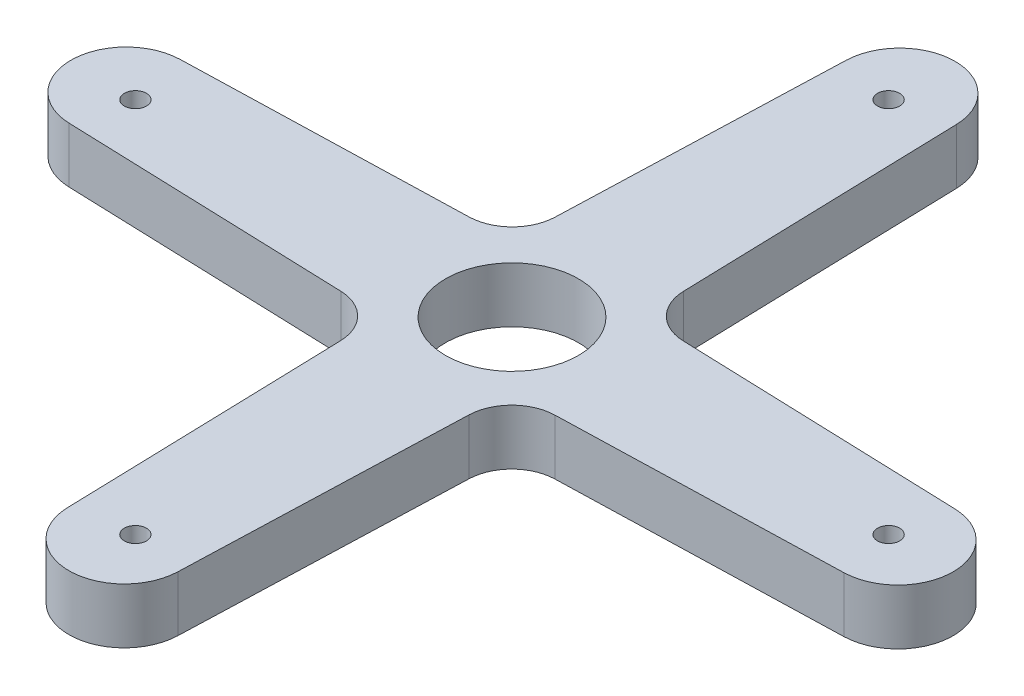
ISO-10303-21;
HEADER;
FILE_DESCRIPTION(('STEP AP214'),'2;1');
FILE_NAME('part.step','',(''),(''),'','','');
FILE_SCHEMA(('AUTOMOTIVE_DESIGN { 1 0 10303 214 1 1 1 1 }'));
ENDSEC;
DATA;
#1=APPLICATION_CONTEXT('core data for automotive mechanical design processes');
#2=APPLICATION_PROTOCOL_DEFINITION('international standard','automotive_design',2000,#1);
#3=PRODUCT_CONTEXT('',#1,'mechanical');
#4=PRODUCT('Part','Part','',(#3));
#5=PRODUCT_RELATED_PRODUCT_CATEGORY('part','',(#4));
#6=PRODUCT_DEFINITION_FORMATION('','',#4);
#7=PRODUCT_DEFINITION_CONTEXT('part definition',#1,'design');
#8=PRODUCT_DEFINITION('design','',#6,#7);
#9=PRODUCT_DEFINITION_SHAPE('','',#8);
#10=(LENGTH_UNIT() NAMED_UNIT(*) SI_UNIT(.MILLI.,.METRE.));
#11=(NAMED_UNIT(*) PLANE_ANGLE_UNIT() SI_UNIT($,.RADIAN.));
#12=(NAMED_UNIT(*) SI_UNIT($,.STERADIAN.) SOLID_ANGLE_UNIT());
#13=UNCERTAINTY_MEASURE_WITH_UNIT(LENGTH_MEASURE(1.E-05),#10,'distance_accuracy_value','');
#14=(GEOMETRIC_REPRESENTATION_CONTEXT(3) GLOBAL_UNCERTAINTY_ASSIGNED_CONTEXT((#13)) GLOBAL_UNIT_ASSIGNED_CONTEXT((#10,
#11,#12)) REPRESENTATION_CONTEXT('',''));
#15=CARTESIAN_POINT('',(0.,0.,0.));
#16=DIRECTION('',(0.,0.,1.));
#17=DIRECTION('',(1.,0.,0.));
#18=AXIS2_PLACEMENT_3D('',#15,#16,#17);
#19=CARTESIAN_POINT('',(2.91547513756856,2.5,2.91547513756856));
#20=DIRECTION('',(-0.999409390507672,0.,-0.0343637914829516));
#21=DIRECTION('',(-0.0343637914829516,0.,0.999409390507672));
#22=AXIS2_PLACEMENT_3D('',#19,#20,#21);
#23=PLANE('',#22);
#24=DIRECTION('',(0.0343637914829516,0.,-0.999409390507672));
#25=VECTOR('',#24,1.);
#26=CARTESIAN_POINT('',(2.91547513756856,0.,2.91547513756856));
#27=LINE('',#26,#25);
#28=CARTESIAN_POINT('',(2.4144495032817,0.,17.486909260016));
#29=VERTEX_POINT('',#28);
#30=CARTESIAN_POINT('',(2.8509430323518,0.,4.79227595493043));
#31=VERTEX_POINT('',#30);
#32=EDGE_CURVE('E214',#29,#31,#27,.T.);
#33=ORIENTED_EDGE('',*,*,#32,.T.);
#34=DIRECTION('',(0.,-1.,0.));
#35=VECTOR('',#34,1.);
#36=CARTESIAN_POINT('',(2.8509430323518,2.5,4.79227595493043));
#37=LINE('',#36,#35);
#38=CARTESIAN_POINT('',(2.8509430323518,2.5,4.79227595493043));
#39=VERTEX_POINT('',#38);
#40=EDGE_CURVE('E287',#31,#39,#37,.F.);
#41=ORIENTED_EDGE('',*,*,#40,.T.);
#42=DIRECTION('',(0.0343637914829516,0.,-0.999409390507672));
#43=VECTOR('',#42,1.);
#44=CARTESIAN_POINT('',(2.91547513756856,2.5,2.91547513756856));
#45=LINE('',#44,#43);
#46=CARTESIAN_POINT('',(2.4144495032817,2.5,17.486909260016));
#47=VERTEX_POINT('',#46);
#48=EDGE_CURVE('E165',#47,#39,#45,.T.);
#49=ORIENTED_EDGE('',*,*,#48,.F.);
#50=DIRECTION('',(0.,-1.,0.));
#51=VECTOR('',#50,1.);
#52=CARTESIAN_POINT('',(2.4144495032817,2.5,17.486909260016));
#53=LINE('',#52,#51);
#54=EDGE_CURVE('E213',#47,#29,#53,.T.);
#55=ORIENTED_EDGE('',*,*,#54,.T.);
#56=EDGE_LOOP('',(#33,#41,#49,#55));
#57=FACE_BOUND('',#56,.T.);
#58=ADVANCED_FACE('F39',(#57),#23,.F.);
#59=CARTESIAN_POINT('',(2.91547513756856,2.5,2.91547513756856));
#60=DIRECTION('',(-0.0285717061223697,0.,-0.999591745468747));
#61=DIRECTION('',(-0.999591745468748,0.,0.0285717061223697));
#62=AXIS2_PLACEMENT_3D('',#59,#60,#61);
#63=PLANE('',#62);
#64=DIRECTION('',(0.999591745468747,0.,-0.0285717061223697));
#65=VECTOR('',#64,1.);
#66=CARTESIAN_POINT('',(2.91547513756856,2.5,2.91547513756856));
#67=LINE('',#66,#65);
#68=CARTESIAN_POINT('',(4.7926184011224,2.5,2.86182004695884));
#69=VERTEX_POINT('',#68);
#70=CARTESIAN_POINT('',(17.486909260016,2.5,2.49897436571314));
#71=VERTEX_POINT('',#70);
#72=EDGE_CURVE('E152',#69,#71,#67,.T.);
#73=ORIENTED_EDGE('',*,*,#72,.F.);
#74=DIRECTION('',(0.,-1.,0.));
#75=VECTOR('',#74,1.);
#76=CARTESIAN_POINT('',(4.7926184011224,0.,2.86182004695884));
#77=LINE('',#76,#75);
#78=CARTESIAN_POINT('',(4.7926184011224,0.,2.86182004695884));
#79=VERTEX_POINT('',#78);
#80=EDGE_CURVE('E284',#69,#79,#77,.T.);
#81=ORIENTED_EDGE('',*,*,#80,.T.);
#82=DIRECTION('',(0.999591745468747,0.,-0.0285717061223697));
#83=VECTOR('',#82,1.);
#84=CARTESIAN_POINT('',(2.91547513756856,0.,2.91547513756856));
#85=LINE('',#84,#83);
#86=CARTESIAN_POINT('',(17.486909260016,0.,2.49897436571314));
#87=VERTEX_POINT('',#86);
#88=EDGE_CURVE('E171',#79,#87,#85,.T.);
#89=ORIENTED_EDGE('',*,*,#88,.T.);
#90=DIRECTION('',(0.,-1.,0.));
#91=VECTOR('',#90,1.);
#92=CARTESIAN_POINT('',(17.486909260016,2.5,2.49897436571314));
#93=LINE('',#92,#91);
#94=EDGE_CURVE('E168',#71,#87,#93,.T.);
#95=ORIENTED_EDGE('',*,*,#94,.F.);
#96=EDGE_LOOP('',(#73,#81,#89,#95));
#97=FACE_BOUND('',#96,.T.);
#98=ADVANCED_FACE('F169',(#97),#63,.F.);
#99=CARTESIAN_POINT('',(17.4154801375686,2.5,0.));
#100=DIRECTION('',(0.,-1.,0.));
#101=DIRECTION('',(0.,0.,-1.));
#102=AXIS2_PLACEMENT_3D('',#99,#100,#101);
#103=CYLINDRICAL_SURFACE('',#102,2.499995);
#104=CARTESIAN_POINT('',(17.4154801375686,0.,0.));
#105=DIRECTION('',(0.,1.,0.));
#106=DIRECTION('',(0.,0.,1.));
#107=AXIS2_PLACEMENT_3D('',#104,#105,#106);
#108=CIRCLE('',#107,2.499995);
#109=CARTESIAN_POINT('',(17.486909260016,0.,-2.49897436571314));
#110=VERTEX_POINT('',#109);
#111=EDGE_CURVE('E221',#87,#110,#108,.T.);
#112=ORIENTED_EDGE('',*,*,#111,.T.);
#113=DIRECTION('',(0.,-1.,0.));
#114=VECTOR('',#113,1.);
#115=CARTESIAN_POINT('',(17.486909260016,2.5,-2.49897436571314));
#116=LINE('',#115,#114);
#117=CARTESIAN_POINT('',(17.486909260016,2.5,-2.49897436571314));
#118=VERTEX_POINT('',#117);
#119=EDGE_CURVE('E176',#118,#110,#116,.T.);
#120=ORIENTED_EDGE('',*,*,#119,.F.);
#121=CARTESIAN_POINT('',(17.4154801375686,2.5,0.));
#122=DIRECTION('',(0.,1.,0.));
#123=DIRECTION('',(0.,0.,1.));
#124=AXIS2_PLACEMENT_3D('',#121,#122,#123);
#125=CIRCLE('',#124,2.499995);
#126=EDGE_CURVE('E157',#71,#118,#125,.T.);
#127=ORIENTED_EDGE('',*,*,#126,.F.);
#128=ORIENTED_EDGE('',*,*,#94,.T.);
#129=EDGE_LOOP('',(#112,#120,#127,#128));
#130=FACE_BOUND('',#129,.T.);
#131=ADVANCED_FACE('F178',(#130),#103,.T.);
#132=CARTESIAN_POINT('',(2.91547513756856,2.5,-3.));
#133=DIRECTION('',(-0.0343637914829516,0.,0.999409390507672));
#134=DIRECTION('',(0.999409390507672,0.,0.0343637914829517));
#135=AXIS2_PLACEMENT_3D('',#132,#133,#134);
#136=PLANE('',#135);
#137=DIRECTION('',(-0.999409390507672,0.,-0.0343637914829516));
#138=VECTOR('',#137,1.);
#139=CARTESIAN_POINT('',(2.91547513756856,0.,-3.));
#140=LINE('',#139,#138);
#141=CARTESIAN_POINT('',(4.79227595493044,0.,-2.93546789478324));
#142=VERTEX_POINT('',#141);
#143=EDGE_CURVE('E224',#110,#142,#140,.T.);
#144=ORIENTED_EDGE('',*,*,#143,.T.);
#145=DIRECTION('',(0.,-1.,0.));
#146=VECTOR('',#145,1.);
#147=CARTESIAN_POINT('',(4.79227595493044,2.5,-2.93546789478324));
#148=LINE('',#147,#146);
#149=CARTESIAN_POINT('',(4.79227595493044,2.5,-2.93546789478324));
#150=VERTEX_POINT('',#149);
#151=EDGE_CURVE('E55',#142,#150,#148,.F.);
#152=ORIENTED_EDGE('',*,*,#151,.T.);
#153=DIRECTION('',(-0.999409390507672,0.,-0.0343637914829516));
#154=VECTOR('',#153,1.);
#155=CARTESIAN_POINT('',(2.91547513756856,2.5,-3.));
#156=LINE('',#155,#154);
#157=EDGE_CURVE('E181',#118,#150,#156,.T.);
#158=ORIENTED_EDGE('',*,*,#157,.F.);
#159=ORIENTED_EDGE('',*,*,#119,.T.);
#160=EDGE_LOOP('',(#144,#152,#158,#159));
#161=FACE_BOUND('',#160,.T.);
#162=ADVANCED_FACE('F350',(#161),#136,.F.);
#163=CARTESIAN_POINT('',(2.91547513756856,2.5,-3.));
#164=DIRECTION('',(-0.999591745468747,0.,0.0285717061223697));
#165=DIRECTION('',(0.0285717061223697,0.,0.999591745468748));
#166=AXIS2_PLACEMENT_3D('',#163,#164,#165);
#167=PLANE('',#166);
#168=DIRECTION('',(-0.0285717061223697,0.,-0.999591745468747));
#169=VECTOR('',#168,1.);
#170=CARTESIAN_POINT('',(2.91547513756856,2.5,-3.));
#171=LINE('',#170,#169);
#172=CARTESIAN_POINT('',(2.86182004695885,2.5,-4.87714326355385));
#173=VERTEX_POINT('',#172);
#174=CARTESIAN_POINT('',(2.49897436571314,2.5,-17.5714341224474));
#175=VERTEX_POINT('',#174);
#176=EDGE_CURVE('E184',#173,#175,#171,.T.);
#177=ORIENTED_EDGE('',*,*,#176,.F.);
#178=DIRECTION('',(0.,-1.,0.));
#179=VECTOR('',#178,1.);
#180=CARTESIAN_POINT('',(2.86182004695885,0.,-4.87714326355385));
#181=LINE('',#180,#179);
#182=CARTESIAN_POINT('',(2.86182004695885,0.,-4.87714326355385));
#183=VERTEX_POINT('',#182);
#184=EDGE_CURVE('E297',#173,#183,#181,.T.);
#185=ORIENTED_EDGE('',*,*,#184,.T.);
#186=DIRECTION('',(-0.0285717061223697,0.,-0.999591745468747));
#187=VECTOR('',#186,1.);
#188=CARTESIAN_POINT('',(2.91547513756856,0.,-3.));
#189=LINE('',#188,#187);
#190=CARTESIAN_POINT('',(2.49897436571314,0.,-17.5714341224474));
#191=VERTEX_POINT('',#190);
#192=EDGE_CURVE('E227',#183,#191,#189,.T.);
#193=ORIENTED_EDGE('',*,*,#192,.T.);
#194=DIRECTION('',(0.,-1.,0.));
#195=VECTOR('',#194,1.);
#196=CARTESIAN_POINT('',(2.49897436571314,2.5,-17.5714341224474));
#197=LINE('',#196,#195);
#198=EDGE_CURVE('E272',#175,#191,#197,.T.);
#199=ORIENTED_EDGE('',*,*,#198,.F.);
#200=EDGE_LOOP('',(#177,#185,#193,#199));
#201=FACE_BOUND('',#200,.T.);
#202=ADVANCED_FACE('F346',(#201),#167,.F.);
#203=CARTESIAN_POINT('',(0.,2.5,-17.500005));
#204=DIRECTION('',(0.,-1.,0.));
#205=DIRECTION('',(0.,0.,-1.));
#206=AXIS2_PLACEMENT_3D('',#203,#204,#205);
#207=CYLINDRICAL_SURFACE('',#206,2.499995);
#208=CARTESIAN_POINT('',(0.,0.,-17.500005));
#209=DIRECTION('',(0.,1.,0.));
#210=DIRECTION('',(0.,0.,1.));
#211=AXIS2_PLACEMENT_3D('',#208,#209,#210);
#212=CIRCLE('',#211,2.499995);
#213=CARTESIAN_POINT('',(-2.49897436571314,0.,-17.5714341224474));
#214=VERTEX_POINT('',#213);
#215=EDGE_CURVE('E230',#191,#214,#212,.T.);
#216=ORIENTED_EDGE('',*,*,#215,.T.);
#217=DIRECTION('',(0.,-1.,0.));
#218=VECTOR('',#217,1.);
#219=CARTESIAN_POINT('',(-2.49897436571314,2.5,-17.5714341224474));
#220=LINE('',#219,#218);
#221=CARTESIAN_POINT('',(-2.49897436571314,2.5,-17.5714341224474));
#222=VERTEX_POINT('',#221);
#223=EDGE_CURVE('E268',#222,#214,#220,.T.);
#224=ORIENTED_EDGE('',*,*,#223,.F.);
#225=CARTESIAN_POINT('',(0.,2.5,-17.500005));
#226=DIRECTION('',(0.,1.,0.));
#227=DIRECTION('',(0.,0.,1.));
#228=AXIS2_PLACEMENT_3D('',#225,#226,#227);
#229=CIRCLE('',#228,2.499995);
#230=EDGE_CURVE('E190',#175,#222,#229,.T.);
#231=ORIENTED_EDGE('',*,*,#230,.F.);
#232=ORIENTED_EDGE('',*,*,#198,.T.);
#233=EDGE_LOOP('',(#216,#224,#231,#232));
#234=FACE_BOUND('',#233,.T.);
#235=ADVANCED_FACE('F342',(#234),#207,.T.);
#236=CARTESIAN_POINT('',(-3.,2.5,-3.));
#237=DIRECTION('',(0.999409390507672,0.,0.0343637914829517));
#238=DIRECTION('',(0.0343637914829517,0.,-0.999409390507672));
#239=AXIS2_PLACEMENT_3D('',#236,#237,#238);
#240=PLANE('',#239);
#241=DIRECTION('',(-0.0343637914829517,0.,0.999409390507672));
#242=VECTOR('',#241,1.);
#243=CARTESIAN_POINT('',(-3.,0.,-3.));
#244=LINE('',#243,#242);
#245=CARTESIAN_POINT('',(-2.93546789478324,0.,-4.87680081736188));
#246=VERTEX_POINT('',#245);
#247=EDGE_CURVE('E233',#214,#246,#244,.T.);
#248=ORIENTED_EDGE('',*,*,#247,.T.);
#249=DIRECTION('',(0.,-1.,0.));
#250=VECTOR('',#249,1.);
#251=CARTESIAN_POINT('',(-2.93546789478324,2.5,-4.87680081736188));
#252=LINE('',#251,#250);
#253=CARTESIAN_POINT('',(-2.93546789478324,2.5,-4.87680081736188));
#254=VERTEX_POINT('',#253);
#255=EDGE_CURVE('E294',#246,#254,#252,.F.);
#256=ORIENTED_EDGE('',*,*,#255,.T.);
#257=DIRECTION('',(-0.0343637914829517,0.,0.999409390507672));
#258=VECTOR('',#257,1.);
#259=CARTESIAN_POINT('',(-3.,2.5,-3.));
#260=LINE('',#259,#258);
#261=EDGE_CURVE('E193',#222,#254,#260,.T.);
#262=ORIENTED_EDGE('',*,*,#261,.F.);
#263=ORIENTED_EDGE('',*,*,#223,.T.);
#264=EDGE_LOOP('',(#248,#256,#262,#263));
#265=FACE_BOUND('',#264,.T.);
#266=ADVANCED_FACE('F338',(#265),#240,.F.);
#267=CARTESIAN_POINT('',(-3.,2.5,-3.));
#268=DIRECTION('',(0.0285717061223699,0.,0.999591745468747));
#269=DIRECTION('',(0.999591745468748,0.,-0.0285717061223699));
#270=AXIS2_PLACEMENT_3D('',#267,#268,#269);
#271=PLANE('',#270);
#272=DIRECTION('',(-0.999591745468747,0.,0.0285717061223699));
#273=VECTOR('',#272,1.);
#274=CARTESIAN_POINT('',(-3.,2.5,-3.));
#275=LINE('',#274,#273);
#276=CARTESIAN_POINT('',(-4.87714326355385,2.5,-2.94634490939029));
#277=VERTEX_POINT('',#276);
#278=CARTESIAN_POINT('',(-17.5714341224474,2.5,-2.58349922814458));
#279=VERTEX_POINT('',#278);
#280=EDGE_CURVE('E197',#277,#279,#275,.T.);
#281=ORIENTED_EDGE('',*,*,#280,.F.);
#282=DIRECTION('',(0.,-1.,0.));
#283=VECTOR('',#282,1.);
#284=CARTESIAN_POINT('',(-4.87714326355385,0.,-2.94634490939029));
#285=LINE('',#284,#283);
#286=CARTESIAN_POINT('',(-4.87714326355385,0.,-2.94634490939029));
#287=VERTEX_POINT('',#286);
#288=EDGE_CURVE('E290',#277,#287,#285,.T.);
#289=ORIENTED_EDGE('',*,*,#288,.T.);
#290=DIRECTION('',(-0.999591745468747,0.,0.0285717061223699));
#291=VECTOR('',#290,1.);
#292=CARTESIAN_POINT('',(-3.,0.,-3.));
#293=LINE('',#292,#291);
#294=CARTESIAN_POINT('',(-17.5714341224474,0.,-2.58349922814458));
#295=VERTEX_POINT('',#294);
#296=EDGE_CURVE('E237',#287,#295,#293,.T.);
#297=ORIENTED_EDGE('',*,*,#296,.T.);
#298=DIRECTION('',(0.,-1.,0.));
#299=VECTOR('',#298,1.);
#300=CARTESIAN_POINT('',(-17.5714341224474,2.5,-2.58349922814458));
#301=LINE('',#300,#299);
#302=EDGE_CURVE('E264',#279,#295,#301,.T.);
#303=ORIENTED_EDGE('',*,*,#302,.F.);
#304=EDGE_LOOP('',(#281,#289,#297,#303));
#305=FACE_BOUND('',#304,.T.);
#306=ADVANCED_FACE('F328',(#305),#271,.F.);
#307=CARTESIAN_POINT('',(-17.500005,2.5,-0.0845248624314393));
#308=DIRECTION('',(0.,-1.,0.));
#309=DIRECTION('',(0.,0.,-1.));
#310=AXIS2_PLACEMENT_3D('',#307,#308,#309);
#311=CYLINDRICAL_SURFACE('',#310,2.499995);
#312=CARTESIAN_POINT('',(-17.500005,0.,-0.0845248624314393));
#313=DIRECTION('',(0.,1.,0.));
#314=DIRECTION('',(0.,0.,1.));
#315=AXIS2_PLACEMENT_3D('',#312,#313,#314);
#316=CIRCLE('',#315,2.499995);
#317=CARTESIAN_POINT('',(-17.5714341224474,0.,2.4144495032817));
#318=VERTEX_POINT('',#317);
#319=EDGE_CURVE('E240',#295,#318,#316,.T.);
#320=ORIENTED_EDGE('',*,*,#319,.T.);
#321=DIRECTION('',(0.,-1.,0.));
#322=VECTOR('',#321,1.);
#323=CARTESIAN_POINT('',(-17.5714341224474,2.5,2.4144495032817));
#324=LINE('',#323,#322);
#325=CARTESIAN_POINT('',(-17.5714341224474,2.5,2.4144495032817));
#326=VERTEX_POINT('',#325);
#327=EDGE_CURVE('E260',#326,#318,#324,.T.);
#328=ORIENTED_EDGE('',*,*,#327,.F.);
#329=CARTESIAN_POINT('',(-17.500005,2.5,-0.0845248624314393));
#330=DIRECTION('',(0.,1.,0.));
#331=DIRECTION('',(0.,0.,1.));
#332=AXIS2_PLACEMENT_3D('',#329,#330,#331);
#333=CIRCLE('',#332,2.499995);
#334=EDGE_CURVE('E200',#279,#326,#333,.T.);
#335=ORIENTED_EDGE('',*,*,#334,.F.);
#336=ORIENTED_EDGE('',*,*,#302,.T.);
#337=EDGE_LOOP('',(#320,#328,#335,#336));
#338=FACE_BOUND('',#337,.T.);
#339=ADVANCED_FACE('F386',(#338),#311,.T.);
#340=CARTESIAN_POINT('',(-3.,2.5,2.91547513756856));
#341=DIRECTION('',(0.0343637914829515,0.,-0.999409390507672));
#342=DIRECTION('',(-0.999409390507672,0.,-0.0343637914829515));
#343=AXIS2_PLACEMENT_3D('',#340,#341,#342);
#344=PLANE('',#343);
#345=DIRECTION('',(0.999409390507672,0.,0.0343637914829515));
#346=VECTOR('',#345,1.);
#347=CARTESIAN_POINT('',(-3.,0.,2.91547513756856));
#348=LINE('',#347,#346);
#349=CARTESIAN_POINT('',(-4.87680081736188,0.,2.8509430323518));
#350=VERTEX_POINT('',#349);
#351=EDGE_CURVE('E243',#318,#350,#348,.T.);
#352=ORIENTED_EDGE('',*,*,#351,.T.);
#353=DIRECTION('',(0.,-1.,0.));
#354=VECTOR('',#353,1.);
#355=CARTESIAN_POINT('',(-4.87680081736188,2.5,2.8509430323518));
#356=LINE('',#355,#354);
#357=CARTESIAN_POINT('',(-4.87680081736188,2.5,2.8509430323518));
#358=VERTEX_POINT('',#357);
#359=EDGE_CURVE('E281',#350,#358,#356,.F.);
#360=ORIENTED_EDGE('',*,*,#359,.T.);
#361=DIRECTION('',(0.999409390507672,0.,0.0343637914829515));
#362=VECTOR('',#361,1.);
#363=CARTESIAN_POINT('',(-3.,2.5,2.91547513756856));
#364=LINE('',#363,#362);
#365=EDGE_CURVE('E203',#326,#358,#364,.T.);
#366=ORIENTED_EDGE('',*,*,#365,.F.);
#367=ORIENTED_EDGE('',*,*,#327,.T.);
#368=EDGE_LOOP('',(#352,#360,#366,#367));
#369=FACE_BOUND('',#368,.T.);
#370=ADVANCED_FACE('F389',(#369),#344,.F.);
#371=CARTESIAN_POINT('',(-3.,2.5,2.91547513756856));
#372=DIRECTION('',(0.999591745468747,0.,-0.0285717061223698));
#373=DIRECTION('',(-0.0285717061223698,0.,-0.999591745468748));
#374=AXIS2_PLACEMENT_3D('',#371,#372,#373);
#375=PLANE('',#374);
#376=DIRECTION('',(0.0285717061223698,0.,0.999591745468747));
#377=VECTOR('',#376,1.);
#378=CARTESIAN_POINT('',(-3.,2.5,2.91547513756856));
#379=LINE('',#378,#377);
#380=CARTESIAN_POINT('',(-2.94634490939029,2.5,4.7926184011224));
#381=VERTEX_POINT('',#380);
#382=CARTESIAN_POINT('',(-2.58349922814458,2.5,17.486909260016));
#383=VERTEX_POINT('',#382);
#384=EDGE_CURVE('E207',#381,#383,#379,.T.);
#385=ORIENTED_EDGE('',*,*,#384,.F.);
#386=DIRECTION('',(0.,-1.,0.));
#387=VECTOR('',#386,1.);
#388=CARTESIAN_POINT('',(-2.94634490939029,0.,4.7926184011224));
#389=LINE('',#388,#387);
#390=CARTESIAN_POINT('',(-2.94634490939029,0.,4.7926184011224));
#391=VERTEX_POINT('',#390);
#392=EDGE_CURVE('E175',#381,#391,#389,.T.);
#393=ORIENTED_EDGE('',*,*,#392,.T.);
#394=DIRECTION('',(0.0285717061223698,0.,0.999591745468747));
#395=VECTOR('',#394,1.);
#396=CARTESIAN_POINT('',(-3.,0.,2.91547513756856));
#397=LINE('',#396,#395);
#398=CARTESIAN_POINT('',(-2.58349922814458,0.,17.486909260016));
#399=VERTEX_POINT('',#398);
#400=EDGE_CURVE('E247',#391,#399,#397,.T.);
#401=ORIENTED_EDGE('',*,*,#400,.T.);
#402=DIRECTION('',(0.,-1.,0.));
#403=VECTOR('',#402,1.);
#404=CARTESIAN_POINT('',(-2.58349922814458,2.5,17.486909260016));
#405=LINE('',#404,#403);
#406=EDGE_CURVE('E256',#383,#399,#405,.T.);
#407=ORIENTED_EDGE('',*,*,#406,.F.);
#408=EDGE_LOOP('',(#385,#393,#401,#407));
#409=FACE_BOUND('',#408,.T.);
#410=ADVANCED_FACE('F393',(#409),#375,.F.);
#411=CARTESIAN_POINT('',(-0.0845248624314404,2.5,17.4154801375686));
#412=DIRECTION('',(0.,-1.,0.));
#413=DIRECTION('',(0.,0.,-1.));
#414=AXIS2_PLACEMENT_3D('',#411,#412,#413);
#415=CYLINDRICAL_SURFACE('',#414,2.499995);
#416=CARTESIAN_POINT('',(-0.0845248624314404,0.,17.4154801375686));
#417=DIRECTION('',(0.,1.,0.));
#418=DIRECTION('',(0.,0.,1.));
#419=AXIS2_PLACEMENT_3D('',#416,#417,#418);
#420=CIRCLE('',#419,2.499995);
#421=EDGE_CURVE('E250',#399,#29,#420,.T.);
#422=ORIENTED_EDGE('',*,*,#421,.T.);
#423=ORIENTED_EDGE('',*,*,#54,.F.);
#424=CARTESIAN_POINT('',(-0.0845248624314404,2.5,17.4154801375686));
#425=DIRECTION('',(0.,1.,0.));
#426=DIRECTION('',(0.,0.,1.));
#427=AXIS2_PLACEMENT_3D('',#424,#425,#426);
#428=CIRCLE('',#427,2.499995);
#429=EDGE_CURVE('E210',#383,#47,#428,.T.);
#430=ORIENTED_EDGE('',*,*,#429,.F.);
#431=ORIENTED_EDGE('',*,*,#406,.T.);
#432=EDGE_LOOP('',(#422,#423,#430,#431));
#433=FACE_BOUND('',#432,.T.);
#434=ADVANCED_FACE('F397',(#433),#415,.T.);
#435=CARTESIAN_POINT('',(-0.0845248624314404,2.5,17.4154801375686));
#436=DIRECTION('',(0.,1.,0.));
#437=DIRECTION('',(0.,0.,1.));
#438=AXIS2_PLACEMENT_3D('',#435,#436,#437);
#439=PLANE('',#438);
#440=CARTESIAN_POINT('',(0.,2.5,-17.));
#441=DIRECTION('',(0.,1.,0.));
#442=DIRECTION('',(0.,0.,1.));
#443=AXIS2_PLACEMENT_3D('',#440,#441,#442);
#444=CIRCLE('',#443,0.5);
#445=CARTESIAN_POINT('',(0.,2.5,-16.5));
#446=VERTEX_POINT('',#445);
#447=EDGE_CURVE('E434',#446,#446,#444,.T.);
#448=ORIENTED_EDGE('',*,*,#447,.F.);
#449=EDGE_LOOP('',(#448));
#450=FACE_BOUND('',#449,.T.);
#451=CARTESIAN_POINT('',(-16.9999999999995,2.5,4.83169060316868E-13));
#452=DIRECTION('',(0.,1.,0.));
#453=DIRECTION('',(0.,0.,1.));
#454=AXIS2_PLACEMENT_3D('',#451,#452,#453);
#455=CIRCLE('',#454,0.500000000000772);
#456=CARTESIAN_POINT('',(-16.9999999999995,2.5,0.500000000001255));
#457=VERTEX_POINT('',#456);
#458=EDGE_CURVE('E458',#457,#457,#455,.T.);
#459=ORIENTED_EDGE('',*,*,#458,.F.);
#460=EDGE_LOOP('',(#459));
#461=FACE_BOUND('',#460,.T.);
#462=CARTESIAN_POINT('',(9.6254171555638E-13,2.5,17.));
#463=DIRECTION('',(0.,1.,0.));
#464=DIRECTION('',(0.,0.,1.));
#465=AXIS2_PLACEMENT_3D('',#462,#463,#464);
#466=CIRCLE('',#465,0.500000000001034);
#467=CARTESIAN_POINT('',(9.6254171555638E-13,2.5,17.500000000001));
#468=VERTEX_POINT('',#467);
#469=EDGE_CURVE('E450',#468,#468,#466,.T.);
#470=ORIENTED_EDGE('',*,*,#469,.F.);
#471=EDGE_LOOP('',(#470));
#472=FACE_BOUND('',#471,.T.);
#473=CARTESIAN_POINT('',(17.0000000000005,2.5,-4.81087160758318E-13));
#474=DIRECTION('',(0.,1.,0.));
#475=DIRECTION('',(0.,0.,1.));
#476=AXIS2_PLACEMENT_3D('',#473,#474,#475);
#477=CIRCLE('',#476,0.500000000000378);
#478=CARTESIAN_POINT('',(17.0000000000005,2.5,0.499999999999897));
#479=VERTEX_POINT('',#478);
#480=EDGE_CURVE('E449',#479,#479,#477,.T.);
#481=ORIENTED_EDGE('',*,*,#480,.F.);
#482=EDGE_LOOP('',(#481));
#483=FACE_BOUND('',#482,.T.);
#484=CARTESIAN_POINT('',(0.,2.5,0.));
#485=DIRECTION('',(0.,1.,0.));
#486=DIRECTION('',(0.,0.,1.));
#487=AXIS2_PLACEMENT_3D('',#484,#485,#486);
#488=CIRCLE('',#487,3.);
#489=CARTESIAN_POINT('',(0.,2.5,3.));
#490=VERTEX_POINT('',#489);
#491=EDGE_CURVE('E442',#490,#490,#488,.T.);
#492=ORIENTED_EDGE('',*,*,#491,.F.);
#493=EDGE_LOOP('',(#492));
#494=FACE_BOUND('',#493,.T.);
#495=ORIENTED_EDGE('',*,*,#48,.T.);
#496=CARTESIAN_POINT('',(4.84976181336714,2.5,4.86100353789634));
#497=DIRECTION('',(0.,1.,0.));
#498=DIRECTION('',(0.,0.,1.));
#499=AXIS2_PLACEMENT_3D('',#496,#497,#498);
#500=CIRCLE('',#499,2.);
#501=EDGE_CURVE('E160',#39,#69,#500,.F.);
#502=ORIENTED_EDGE('',*,*,#501,.T.);
#503=ORIENTED_EDGE('',*,*,#72,.T.);
#504=ORIENTED_EDGE('',*,*,#126,.T.);
#505=ORIENTED_EDGE('',*,*,#157,.T.);
#506=CARTESIAN_POINT('',(4.86100353789634,2.5,-4.93428667579859));
#507=DIRECTION('',(0.,1.,0.));
#508=DIRECTION('',(0.,0.,1.));
#509=AXIS2_PLACEMENT_3D('',#506,#507,#508);
#510=CIRCLE('',#509,2.);
#511=EDGE_CURVE('E11',#150,#173,#510,.F.);
#512=ORIENTED_EDGE('',*,*,#511,.T.);
#513=ORIENTED_EDGE('',*,*,#176,.T.);
#514=ORIENTED_EDGE('',*,*,#230,.T.);
#515=ORIENTED_EDGE('',*,*,#261,.T.);
#516=CARTESIAN_POINT('',(-4.93428667579859,2.5,-4.94552840032778));
#517=DIRECTION('',(0.,1.,0.));
#518=DIRECTION('',(0.,0.,1.));
#519=AXIS2_PLACEMENT_3D('',#516,#517,#518);
#520=CIRCLE('',#519,2.);
#521=EDGE_CURVE('E317',#254,#277,#520,.F.);
#522=ORIENTED_EDGE('',*,*,#521,.T.);
#523=ORIENTED_EDGE('',*,*,#280,.T.);
#524=ORIENTED_EDGE('',*,*,#334,.T.);
#525=ORIENTED_EDGE('',*,*,#365,.T.);
#526=CARTESIAN_POINT('',(-4.94552840032778,2.5,4.84976181336714));
#527=DIRECTION('',(0.,1.,0.));
#528=DIRECTION('',(0.,0.,1.));
#529=AXIS2_PLACEMENT_3D('',#526,#527,#528);
#530=CIRCLE('',#529,2.);
#531=EDGE_CURVE('E306',#358,#381,#530,.F.);
#532=ORIENTED_EDGE('',*,*,#531,.T.);
#533=ORIENTED_EDGE('',*,*,#384,.T.);
#534=ORIENTED_EDGE('',*,*,#429,.T.);
#535=EDGE_LOOP('',(#495,#502,#503,#504,#505,#512,#513,#514,#515,#522,#523,#524,#525,#532,#533,#534));
#536=FACE_BOUND('',#535,.T.);
#537=ADVANCED_FACE('F155',(#450,#461,#472,#483,#494,#536),#439,.T.);
#538=CARTESIAN_POINT('',(-0.0845248624314404,0.,17.4154801375686));
#539=DIRECTION('',(0.,1.,0.));
#540=DIRECTION('',(0.,0.,1.));
#541=AXIS2_PLACEMENT_3D('',#538,#539,#540);
#542=PLANE('',#541);
#543=CARTESIAN_POINT('',(0.,0.,-17.));
#544=DIRECTION('',(0.,1.,0.));
#545=DIRECTION('',(0.,0.,1.));
#546=AXIS2_PLACEMENT_3D('',#543,#544,#545);
#547=CIRCLE('',#546,0.5);
#548=CARTESIAN_POINT('',(0.,0.,-16.5));
#549=VERTEX_POINT('',#548);
#550=EDGE_CURVE('E218',#549,#549,#547,.T.);
#551=ORIENTED_EDGE('',*,*,#550,.T.);
#552=EDGE_LOOP('',(#551));
#553=FACE_BOUND('',#552,.T.);
#554=CARTESIAN_POINT('',(-16.9999999999995,0.,4.83169060316868E-13));
#555=DIRECTION('',(0.,1.,0.));
#556=DIRECTION('',(0.,0.,1.));
#557=AXIS2_PLACEMENT_3D('',#554,#555,#556);
#558=CIRCLE('',#557,0.500000000000772);
#559=CARTESIAN_POINT('',(-16.9999999999995,0.,0.500000000001255));
#560=VERTEX_POINT('',#559);
#561=EDGE_CURVE('E454',#560,#560,#558,.T.);
#562=ORIENTED_EDGE('',*,*,#561,.T.);
#563=EDGE_LOOP('',(#562));
#564=FACE_BOUND('',#563,.T.);
#565=CARTESIAN_POINT('',(9.6254171555638E-13,0.,17.));
#566=DIRECTION('',(0.,1.,0.));
#567=DIRECTION('',(0.,0.,1.));
#568=AXIS2_PLACEMENT_3D('',#565,#566,#567);
#569=CIRCLE('',#568,0.500000000001034);
#570=CARTESIAN_POINT('',(9.6254171555638E-13,0.,17.500000000001));
#571=VERTEX_POINT('',#570);
#572=EDGE_CURVE('E445',#571,#571,#569,.T.);
#573=ORIENTED_EDGE('',*,*,#572,.T.);
#574=EDGE_LOOP('',(#573));
#575=FACE_BOUND('',#574,.T.);
#576=CARTESIAN_POINT('',(17.0000000000005,0.,-4.81087160758318E-13));
#577=DIRECTION('',(0.,1.,0.));
#578=DIRECTION('',(0.,0.,1.));
#579=AXIS2_PLACEMENT_3D('',#576,#577,#578);
#580=CIRCLE('',#579,0.500000000000378);
#581=CARTESIAN_POINT('',(17.0000000000005,0.,0.499999999999897));
#582=VERTEX_POINT('',#581);
#583=EDGE_CURVE('E465',#582,#582,#580,.T.);
#584=ORIENTED_EDGE('',*,*,#583,.T.);
#585=EDGE_LOOP('',(#584));
#586=FACE_BOUND('',#585,.T.);
#587=CARTESIAN_POINT('',(0.,0.,0.));
#588=DIRECTION('',(0.,1.,0.));
#589=DIRECTION('',(0.,0.,1.));
#590=AXIS2_PLACEMENT_3D('',#587,#588,#589);
#591=CIRCLE('',#590,3.);
#592=CARTESIAN_POINT('',(0.,0.,3.));
#593=VERTEX_POINT('',#592);
#594=EDGE_CURVE('E436',#593,#593,#591,.T.);
#595=ORIENTED_EDGE('',*,*,#594,.T.);
#596=EDGE_LOOP('',(#595));
#597=FACE_BOUND('',#596,.T.);
#598=ORIENTED_EDGE('',*,*,#32,.F.);
#599=ORIENTED_EDGE('',*,*,#421,.F.);
#600=ORIENTED_EDGE('',*,*,#400,.F.);
#601=CARTESIAN_POINT('',(-4.94552840032778,0.,4.84976181336714));
#602=DIRECTION('',(0.,1.,0.));
#603=DIRECTION('',(0.,0.,1.));
#604=AXIS2_PLACEMENT_3D('',#601,#602,#603);
#605=CIRCLE('',#604,2.);
#606=EDGE_CURVE('E303',#391,#350,#605,.T.);
#607=ORIENTED_EDGE('',*,*,#606,.T.);
#608=ORIENTED_EDGE('',*,*,#351,.F.);
#609=ORIENTED_EDGE('',*,*,#319,.F.);
#610=ORIENTED_EDGE('',*,*,#296,.F.);
#611=CARTESIAN_POINT('',(-4.93428667579859,0.,-4.94552840032778));
#612=DIRECTION('',(0.,1.,0.));
#613=DIRECTION('',(0.,0.,1.));
#614=AXIS2_PLACEMENT_3D('',#611,#612,#613);
#615=CIRCLE('',#614,2.);
#616=EDGE_CURVE('E314',#287,#246,#615,.T.);
#617=ORIENTED_EDGE('',*,*,#616,.T.);
#618=ORIENTED_EDGE('',*,*,#247,.F.);
#619=ORIENTED_EDGE('',*,*,#215,.F.);
#620=ORIENTED_EDGE('',*,*,#192,.F.);
#621=CARTESIAN_POINT('',(4.86100353789634,0.,-4.93428667579859));
#622=DIRECTION('',(0.,1.,0.));
#623=DIRECTION('',(0.,0.,1.));
#624=AXIS2_PLACEMENT_3D('',#621,#622,#623);
#625=CIRCLE('',#624,2.);
#626=EDGE_CURVE('E48',#183,#142,#625,.T.);
#627=ORIENTED_EDGE('',*,*,#626,.T.);
#628=ORIENTED_EDGE('',*,*,#143,.F.);
#629=ORIENTED_EDGE('',*,*,#111,.F.);
#630=ORIENTED_EDGE('',*,*,#88,.F.);
#631=CARTESIAN_POINT('',(4.84976181336714,0.,4.86100353789634));
#632=DIRECTION('',(0.,1.,0.));
#633=DIRECTION('',(0.,0.,1.));
#634=AXIS2_PLACEMENT_3D('',#631,#632,#633);
#635=CIRCLE('',#634,2.);
#636=EDGE_CURVE('E309',#79,#31,#635,.T.);
#637=ORIENTED_EDGE('',*,*,#636,.T.);
#638=EDGE_LOOP('',(#598,#599,#600,#607,#608,#609,#610,#617,#618,#619,#620,#627,#628,#629,#630,#637));
#639=FACE_BOUND('',#638,.T.);
#640=ADVANCED_FACE('F334',(#553,#564,#575,#586,#597,#639),#542,.F.);
#641=CARTESIAN_POINT('',(-4.94552840032778,2.5,4.84976181336714));
#642=DIRECTION('',(0.,1.,0.));
#643=DIRECTION('',(0.,0.,1.));
#644=AXIS2_PLACEMENT_3D('',#641,#642,#643);
#645=CYLINDRICAL_SURFACE('',#644,2.);
#646=ORIENTED_EDGE('',*,*,#531,.F.);
#647=ORIENTED_EDGE('',*,*,#359,.F.);
#648=ORIENTED_EDGE('',*,*,#606,.F.);
#649=ORIENTED_EDGE('',*,*,#392,.F.);
#650=EDGE_LOOP('',(#646,#647,#648,#649));
#651=FACE_BOUND('',#650,.T.);
#652=ADVANCED_FACE('F359',(#651),#645,.F.);
#653=CARTESIAN_POINT('',(4.84976181336714,2.5,4.86100353789634));
#654=DIRECTION('',(0.,1.,0.));
#655=DIRECTION('',(0.,0.,1.));
#656=AXIS2_PLACEMENT_3D('',#653,#654,#655);
#657=CYLINDRICAL_SURFACE('',#656,2.);
#658=ORIENTED_EDGE('',*,*,#501,.F.);
#659=ORIENTED_EDGE('',*,*,#40,.F.);
#660=ORIENTED_EDGE('',*,*,#636,.F.);
#661=ORIENTED_EDGE('',*,*,#80,.F.);
#662=EDGE_LOOP('',(#658,#659,#660,#661));
#663=FACE_BOUND('',#662,.T.);
#664=ADVANCED_FACE('F357',(#663),#657,.F.);
#665=CARTESIAN_POINT('',(-4.93428667579859,2.5,-4.94552840032778));
#666=DIRECTION('',(0.,1.,0.));
#667=DIRECTION('',(0.,0.,1.));
#668=AXIS2_PLACEMENT_3D('',#665,#666,#667);
#669=CYLINDRICAL_SURFACE('',#668,2.);
#670=ORIENTED_EDGE('',*,*,#521,.F.);
#671=ORIENTED_EDGE('',*,*,#255,.F.);
#672=ORIENTED_EDGE('',*,*,#616,.F.);
#673=ORIENTED_EDGE('',*,*,#288,.F.);
#674=EDGE_LOOP('',(#670,#671,#672,#673));
#675=FACE_BOUND('',#674,.T.);
#676=ADVANCED_FACE('F331',(#675),#669,.F.);
#677=CARTESIAN_POINT('',(4.86100353789634,2.5,-4.93428667579859));
#678=DIRECTION('',(0.,1.,0.));
#679=DIRECTION('',(0.,0.,1.));
#680=AXIS2_PLACEMENT_3D('',#677,#678,#679);
#681=CYLINDRICAL_SURFACE('',#680,2.);
#682=ORIENTED_EDGE('',*,*,#511,.F.);
#683=ORIENTED_EDGE('',*,*,#151,.F.);
#684=ORIENTED_EDGE('',*,*,#626,.F.);
#685=ORIENTED_EDGE('',*,*,#184,.F.);
#686=EDGE_LOOP('',(#682,#683,#684,#685));
#687=FACE_BOUND('',#686,.T.);
#688=ADVANCED_FACE('F41',(#687),#681,.F.);
#689=CARTESIAN_POINT('',(0.,0.,0.));
#690=DIRECTION('',(0.,1.,0.));
#691=DIRECTION('',(0.,0.,1.));
#692=AXIS2_PLACEMENT_3D('',#689,#690,#691);
#693=CYLINDRICAL_SURFACE('',#692,3.);
#694=ORIENTED_EDGE('',*,*,#594,.F.);
#695=EDGE_LOOP('',(#694));
#696=FACE_BOUND('',#695,.T.);
#697=ORIENTED_EDGE('',*,*,#491,.T.);
#698=EDGE_LOOP('',(#697));
#699=FACE_BOUND('',#698,.T.);
#700=ADVANCED_FACE('F412',(#696,#699),#693,.F.);
#701=CARTESIAN_POINT('',(17.0000000000005,0.,-4.81087160758318E-13));
#702=DIRECTION('',(0.,1.,0.));
#703=DIRECTION('',(0.,0.,1.));
#704=AXIS2_PLACEMENT_3D('',#701,#702,#703);
#705=CYLINDRICAL_SURFACE('',#704,0.500000000000378);
#706=ORIENTED_EDGE('',*,*,#583,.F.);
#707=EDGE_LOOP('',(#706));
#708=FACE_BOUND('',#707,.T.);
#709=ORIENTED_EDGE('',*,*,#480,.T.);
#710=EDGE_LOOP('',(#709));
#711=FACE_BOUND('',#710,.T.);
#712=ADVANCED_FACE('F408',(#708,#711),#705,.F.);
#713=CARTESIAN_POINT('',(9.6254171555638E-13,0.,17.));
#714=DIRECTION('',(0.,1.,0.));
#715=DIRECTION('',(0.,0.,1.));
#716=AXIS2_PLACEMENT_3D('',#713,#714,#715);
#717=CYLINDRICAL_SURFACE('',#716,0.500000000001034);
#718=ORIENTED_EDGE('',*,*,#572,.F.);
#719=EDGE_LOOP('',(#718));
#720=FACE_BOUND('',#719,.T.);
#721=ORIENTED_EDGE('',*,*,#469,.T.);
#722=EDGE_LOOP('',(#721));
#723=FACE_BOUND('',#722,.T.);
#724=ADVANCED_FACE('F411',(#720,#723),#717,.F.);
#725=CARTESIAN_POINT('',(-16.9999999999995,0.,4.83169060316868E-13));
#726=DIRECTION('',(0.,1.,0.));
#727=DIRECTION('',(0.,0.,1.));
#728=AXIS2_PLACEMENT_3D('',#725,#726,#727);
#729=CYLINDRICAL_SURFACE('',#728,0.500000000000772);
#730=ORIENTED_EDGE('',*,*,#561,.F.);
#731=EDGE_LOOP('',(#730));
#732=FACE_BOUND('',#731,.T.);
#733=ORIENTED_EDGE('',*,*,#458,.T.);
#734=EDGE_LOOP('',(#733));
#735=FACE_BOUND('',#734,.T.);
#736=ADVANCED_FACE('F417',(#732,#735),#729,.F.);
#737=CARTESIAN_POINT('',(0.,0.,-17.));
#738=DIRECTION('',(0.,1.,0.));
#739=DIRECTION('',(0.,0.,1.));
#740=AXIS2_PLACEMENT_3D('',#737,#738,#739);
#741=CYLINDRICAL_SURFACE('',#740,0.5);
#742=ORIENTED_EDGE('',*,*,#550,.F.);
#743=EDGE_LOOP('',(#742));
#744=FACE_BOUND('',#743,.T.);
#745=ORIENTED_EDGE('',*,*,#447,.T.);
#746=EDGE_LOOP('',(#745));
#747=FACE_BOUND('',#746,.T.);
#748=ADVANCED_FACE('F420',(#744,#747),#741,.F.);
#749=CLOSED_SHELL('',(#58,#98,#131,#162,#202,#235,#266,#306,#339,#370,#410,#434,#537,#640,#652,
#664,#676,#688,#700,#712,#724,#736,#748));
#750=MANIFOLD_SOLID_BREP('B2',#749);
#751=ADVANCED_BREP_SHAPE_REPRESENTATION('',(#18,#750),#14);
#752=SHAPE_DEFINITION_REPRESENTATION(#9,#751);
ENDSEC;
END-ISO-10303-21;
